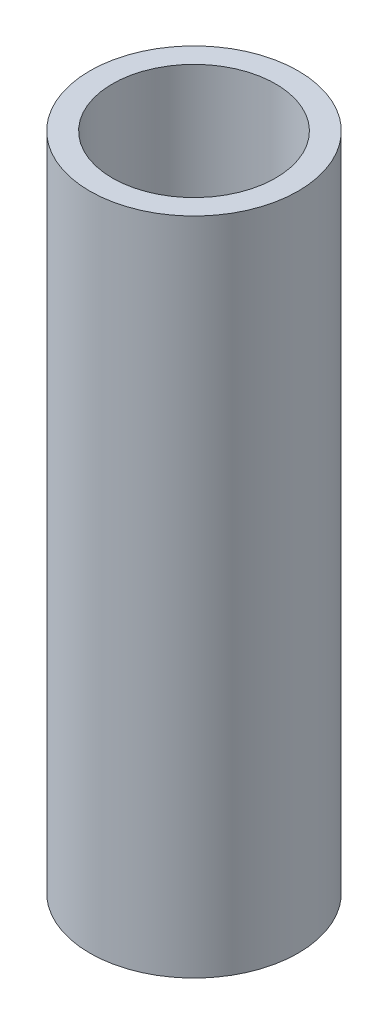
ISO-10303-21;
HEADER;
FILE_DESCRIPTION(('STEP AP214'),'2;1');
FILE_NAME('part.step','',(''),(''),'','','');
FILE_SCHEMA(('AUTOMOTIVE_DESIGN { 1 0 10303 214 1 1 1 1 }'));
ENDSEC;
DATA;
#1=APPLICATION_CONTEXT('core data for automotive mechanical design processes');
#2=APPLICATION_PROTOCOL_DEFINITION('international standard','automotive_design',2000,#1);
#3=PRODUCT_CONTEXT('',#1,'mechanical');
#4=PRODUCT('Part','Part','',(#3));
#5=PRODUCT_RELATED_PRODUCT_CATEGORY('part','',(#4));
#6=PRODUCT_DEFINITION_FORMATION('','',#4);
#7=PRODUCT_DEFINITION_CONTEXT('part definition',#1,'design');
#8=PRODUCT_DEFINITION('design','',#6,#7);
#9=PRODUCT_DEFINITION_SHAPE('','',#8);
#10=(LENGTH_UNIT() NAMED_UNIT(*) SI_UNIT(.MILLI.,.METRE.));
#11=(NAMED_UNIT(*) PLANE_ANGLE_UNIT() SI_UNIT($,.RADIAN.));
#12=(NAMED_UNIT(*) SI_UNIT($,.STERADIAN.) SOLID_ANGLE_UNIT());
#13=UNCERTAINTY_MEASURE_WITH_UNIT(LENGTH_MEASURE(1.E-05),#10,'distance_accuracy_value','');
#14=(GEOMETRIC_REPRESENTATION_CONTEXT(3) GLOBAL_UNCERTAINTY_ASSIGNED_CONTEXT((#13)) GLOBAL_UNIT_ASSIGNED_CONTEXT((#10,
#11,#12)) REPRESENTATION_CONTEXT('',''));
#15=CARTESIAN_POINT('',(0.,0.,0.));
#16=DIRECTION('',(0.,0.,1.));
#17=DIRECTION('',(1.,0.,0.));
#18=AXIS2_PLACEMENT_3D('',#15,#16,#17);
#19=CARTESIAN_POINT('',(0.,21.4714094176867,0.));
#20=DIRECTION('',(0.,1.,0.));
#21=DIRECTION('',(0.,0.,1.));
#22=AXIS2_PLACEMENT_3D('',#19,#20,#21);
#23=CYLINDRICAL_SURFACE('',#22,3.);
#24=CARTESIAN_POINT('',(0.,0.,0.));
#25=DIRECTION('',(0.,1.,0.));
#26=DIRECTION('',(0.,0.,1.));
#27=AXIS2_PLACEMENT_3D('',#24,#25,#26);
#28=CIRCLE('',#27,3.);
#29=CARTESIAN_POINT('',(0.,0.,3.));
#30=VERTEX_POINT('',#29);
#31=EDGE_CURVE('E60',#30,#30,#28,.T.);
#32=ORIENTED_EDGE('',*,*,#31,.T.);
#33=EDGE_LOOP('',(#32));
#34=FACE_BOUND('',#33,.T.);
#35=CARTESIAN_POINT('',(0.,19.,0.));
#36=DIRECTION('',(0.,1.,0.));
#37=DIRECTION('',(0.,0.,1.));
#38=AXIS2_PLACEMENT_3D('',#35,#36,#37);
#39=CIRCLE('',#38,3.);
#40=CARTESIAN_POINT('',(0.,19.,3.));
#41=VERTEX_POINT('',#40);
#42=EDGE_CURVE('E10',#41,#41,#39,.T.);
#43=ORIENTED_EDGE('',*,*,#42,.F.);
#44=EDGE_LOOP('',(#43));
#45=FACE_BOUND('',#44,.T.);
#46=ADVANCED_FACE('F43',(#34,#45),#23,.T.);
#47=CARTESIAN_POINT('',(-3.,19.,0.));
#48=DIRECTION('',(0.,1.,0.));
#49=DIRECTION('',(0.,0.,1.));
#50=AXIS2_PLACEMENT_3D('',#47,#48,#49);
#51=PLANE('',#50);
#52=ORIENTED_EDGE('',*,*,#42,.T.);
#53=EDGE_LOOP('',(#52));
#54=FACE_BOUND('',#53,.T.);
#55=CARTESIAN_POINT('',(0.,19.,0.));
#56=DIRECTION('',(0.,1.,0.));
#57=DIRECTION('',(0.,0.,1.));
#58=AXIS2_PLACEMENT_3D('',#55,#56,#57);
#59=CIRCLE('',#58,2.35);
#60=CARTESIAN_POINT('',(0.,19.,2.35));
#61=VERTEX_POINT('',#60);
#62=EDGE_CURVE('E50',#61,#61,#59,.T.);
#63=ORIENTED_EDGE('',*,*,#62,.F.);
#64=EDGE_LOOP('',(#63));
#65=FACE_BOUND('',#64,.T.);
#66=ADVANCED_FACE('F77',(#54,#65),#51,.T.);
#67=CARTESIAN_POINT('',(0.,21.4714094176867,0.));
#68=DIRECTION('',(0.,1.,0.));
#69=DIRECTION('',(0.,0.,1.));
#70=AXIS2_PLACEMENT_3D('',#67,#68,#69);
#71=CYLINDRICAL_SURFACE('',#70,2.35);
#72=ORIENTED_EDGE('',*,*,#62,.T.);
#73=EDGE_LOOP('',(#72));
#74=FACE_BOUND('',#73,.T.);
#75=CARTESIAN_POINT('',(0.,0.,0.));
#76=DIRECTION('',(0.,1.,0.));
#77=DIRECTION('',(0.,0.,1.));
#78=AXIS2_PLACEMENT_3D('',#75,#76,#77);
#79=CIRCLE('',#78,2.35);
#80=CARTESIAN_POINT('',(0.,0.,2.35));
#81=VERTEX_POINT('',#80);
#82=EDGE_CURVE('E55',#81,#81,#79,.T.);
#83=ORIENTED_EDGE('',*,*,#82,.F.);
#84=EDGE_LOOP('',(#83));
#85=FACE_BOUND('',#84,.T.);
#86=ADVANCED_FACE('F71',(#74,#85),#71,.F.);
#87=CARTESIAN_POINT('',(-3.,0.,0.));
#88=DIRECTION('',(0.,-1.,0.));
#89=DIRECTION('',(0.,0.,-1.));
#90=AXIS2_PLACEMENT_3D('',#87,#88,#89);
#91=PLANE('',#90);
#92=ORIENTED_EDGE('',*,*,#82,.T.);
#93=EDGE_LOOP('',(#92));
#94=FACE_BOUND('',#93,.T.);
#95=ORIENTED_EDGE('',*,*,#31,.F.);
#96=EDGE_LOOP('',(#95));
#97=FACE_BOUND('',#96,.T.);
#98=ADVANCED_FACE('F69',(#94,#97),#91,.T.);
#99=CLOSED_SHELL('',(#46,#66,#86,#98));
#100=MANIFOLD_SOLID_BREP('B2',#99);
#101=ADVANCED_BREP_SHAPE_REPRESENTATION('',(#18,#100),#14);
#102=SHAPE_DEFINITION_REPRESENTATION(#9,#101);
ENDSEC;
END-ISO-10303-21;
